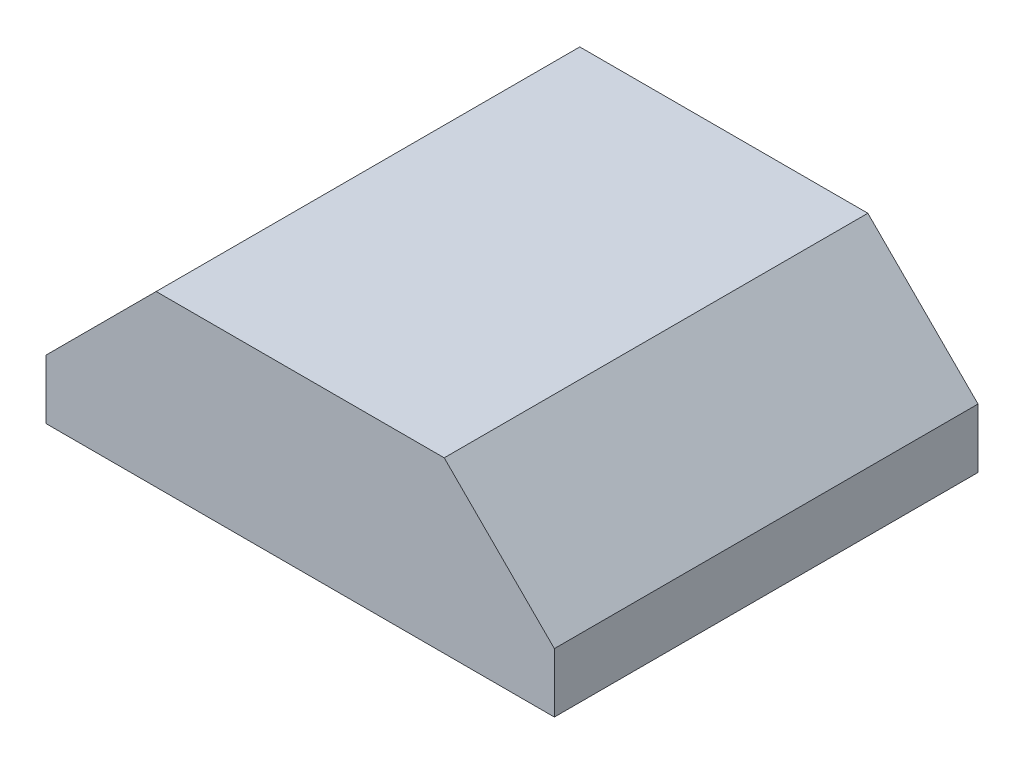
ISO-10303-21;
HEADER;
FILE_DESCRIPTION(('STEP AP214'),'2;1');
FILE_NAME('part.step','',(''),(''),'','','');
FILE_SCHEMA(('AUTOMOTIVE_DESIGN { 1 0 10303 214 1 1 1 1 }'));
ENDSEC;
DATA;
#1=APPLICATION_CONTEXT('core data for automotive mechanical design processes');
#2=APPLICATION_PROTOCOL_DEFINITION('international standard','automotive_design',2000,#1);
#3=PRODUCT_CONTEXT('',#1,'mechanical');
#4=PRODUCT('Part','Part','',(#3));
#5=PRODUCT_RELATED_PRODUCT_CATEGORY('part','',(#4));
#6=PRODUCT_DEFINITION_FORMATION('','',#4);
#7=PRODUCT_DEFINITION_CONTEXT('part definition',#1,'design');
#8=PRODUCT_DEFINITION('design','',#6,#7);
#9=PRODUCT_DEFINITION_SHAPE('','',#8);
#10=(LENGTH_UNIT() NAMED_UNIT(*) SI_UNIT(.MILLI.,.METRE.));
#11=(NAMED_UNIT(*) PLANE_ANGLE_UNIT() SI_UNIT($,.RADIAN.));
#12=(NAMED_UNIT(*) SI_UNIT($,.STERADIAN.) SOLID_ANGLE_UNIT());
#13=UNCERTAINTY_MEASURE_WITH_UNIT(LENGTH_MEASURE(1.E-05),#10,'distance_accuracy_value','');
#14=(GEOMETRIC_REPRESENTATION_CONTEXT(3) GLOBAL_UNCERTAINTY_ASSIGNED_CONTEXT((#13)) GLOBAL_UNIT_ASSIGNED_CONTEXT((#10,
#11,#12)) REPRESENTATION_CONTEXT('',''));
#15=CARTESIAN_POINT('',(0.,0.,0.));
#16=DIRECTION('',(0.,0.,1.));
#17=DIRECTION('',(1.,0.,0.));
#18=AXIS2_PLACEMENT_3D('',#15,#16,#17);
#19=CARTESIAN_POINT('',(3.4,1.80885878693797,10.));
#20=DIRECTION('',(0.707106781186549,0.707106781186546,0.));
#21=DIRECTION('',(-0.707106781186546,0.707106781186549,0.));
#22=AXIS2_PLACEMENT_3D('',#19,#20,#21);
#23=PLANE('',#22);
#24=DIRECTION('',(0.707106781186546,-0.707106781186549,0.));
#25=VECTOR('',#24,1.);
#26=CARTESIAN_POINT('',(3.4,1.80885878693797,0.));
#27=LINE('',#26,#25);
#28=CARTESIAN_POINT('',(3.4,1.80885878693797,0.));
#29=VERTEX_POINT('',#28);
#30=CARTESIAN_POINT('',(6.,-0.791141213062042,0.));
#31=VERTEX_POINT('',#30);
#32=EDGE_CURVE('E127',#29,#31,#27,.T.);
#33=ORIENTED_EDGE('',*,*,#32,.F.);
#34=DIRECTION('',(0.,0.,-1.));
#35=VECTOR('',#34,1.);
#36=CARTESIAN_POINT('',(3.4,1.80885878693797,10.));
#37=LINE('',#36,#35);
#38=CARTESIAN_POINT('',(3.4,1.80885878693797,10.));
#39=VERTEX_POINT('',#38);
#40=EDGE_CURVE('E11',#39,#29,#37,.T.);
#41=ORIENTED_EDGE('',*,*,#40,.F.);
#42=DIRECTION('',(0.707106781186546,-0.707106781186549,0.));
#43=VECTOR('',#42,1.);
#44=CARTESIAN_POINT('',(3.4,1.80885878693797,10.));
#45=LINE('',#44,#43);
#46=CARTESIAN_POINT('',(6.,-0.791141213062042,10.));
#47=VERTEX_POINT('',#46);
#48=EDGE_CURVE('E139',#39,#47,#45,.T.);
#49=ORIENTED_EDGE('',*,*,#48,.T.);
#50=DIRECTION('',(0.,0.,-1.));
#51=VECTOR('',#50,1.);
#52=CARTESIAN_POINT('',(6.,-0.791141213062042,10.));
#53=LINE('',#52,#51);
#54=EDGE_CURVE('E44',#47,#31,#53,.T.);
#55=ORIENTED_EDGE('',*,*,#54,.T.);
#56=EDGE_LOOP('',(#33,#41,#49,#55));
#57=FACE_BOUND('',#56,.T.);
#58=ADVANCED_FACE('F41',(#57),#23,.T.);
#59=CARTESIAN_POINT('',(3.4,1.80885878693797,10.));
#60=DIRECTION('',(0.,-1.,0.));
#61=DIRECTION('',(0.,0.,-1.));
#62=AXIS2_PLACEMENT_3D('',#59,#60,#61);
#63=PLANE('',#62);
#64=DIRECTION('',(-1.,0.,0.));
#65=VECTOR('',#64,1.);
#66=CARTESIAN_POINT('',(3.4,1.80885878693797,0.));
#67=LINE('',#66,#65);
#68=CARTESIAN_POINT('',(-3.4,1.80885878693797,0.));
#69=VERTEX_POINT('',#68);
#70=EDGE_CURVE('E80',#29,#69,#67,.T.);
#71=ORIENTED_EDGE('',*,*,#70,.T.);
#72=DIRECTION('',(0.,0.,-1.));
#73=VECTOR('',#72,1.);
#74=CARTESIAN_POINT('',(-3.4,1.80885878693797,10.));
#75=LINE('',#74,#73);
#76=CARTESIAN_POINT('',(-3.4,1.80885878693797,10.));
#77=VERTEX_POINT('',#76);
#78=EDGE_CURVE('E50',#77,#69,#75,.T.);
#79=ORIENTED_EDGE('',*,*,#78,.F.);
#80=DIRECTION('',(-1.,0.,0.));
#81=VECTOR('',#80,1.);
#82=CARTESIAN_POINT('',(3.4,1.80885878693797,10.));
#83=LINE('',#82,#81);
#84=EDGE_CURVE('E105',#39,#77,#83,.T.);
#85=ORIENTED_EDGE('',*,*,#84,.F.);
#86=ORIENTED_EDGE('',*,*,#40,.T.);
#87=EDGE_LOOP('',(#71,#79,#85,#86));
#88=FACE_BOUND('',#87,.T.);
#89=ADVANCED_FACE('F159',(#88),#63,.F.);
#90=CARTESIAN_POINT('',(-3.4,1.80885878693797,10.));
#91=DIRECTION('',(0.707106781186549,-0.707106781186546,0.));
#92=DIRECTION('',(0.707106781186546,0.707106781186549,0.));
#93=AXIS2_PLACEMENT_3D('',#90,#91,#92);
#94=PLANE('',#93);
#95=DIRECTION('',(-0.707106781186546,-0.707106781186549,0.));
#96=VECTOR('',#95,1.);
#97=CARTESIAN_POINT('',(-3.4,1.80885878693797,0.));
#98=LINE('',#97,#96);
#99=CARTESIAN_POINT('',(-6.,-0.791141213062042,0.));
#100=VERTEX_POINT('',#99);
#101=EDGE_CURVE('E112',#69,#100,#98,.T.);
#102=ORIENTED_EDGE('',*,*,#101,.T.);
#103=DIRECTION('',(0.,0.,-1.));
#104=VECTOR('',#103,1.);
#105=CARTESIAN_POINT('',(-6.,-0.791141213062042,10.));
#106=LINE('',#105,#104);
#107=CARTESIAN_POINT('',(-6.,-0.791141213062042,10.));
#108=VERTEX_POINT('',#107);
#109=EDGE_CURVE('E109',#108,#100,#106,.T.);
#110=ORIENTED_EDGE('',*,*,#109,.F.);
#111=DIRECTION('',(-0.707106781186546,-0.707106781186549,0.));
#112=VECTOR('',#111,1.);
#113=CARTESIAN_POINT('',(-3.4,1.80885878693797,10.));
#114=LINE('',#113,#112);
#115=EDGE_CURVE('E98',#77,#108,#114,.T.);
#116=ORIENTED_EDGE('',*,*,#115,.F.);
#117=ORIENTED_EDGE('',*,*,#78,.T.);
#118=EDGE_LOOP('',(#102,#110,#116,#117));
#119=FACE_BOUND('',#118,.T.);
#120=ADVANCED_FACE('F110',(#119),#94,.F.);
#121=CARTESIAN_POINT('',(-6.,-0.791141213062042,10.));
#122=DIRECTION('',(1.,0.,0.));
#123=DIRECTION('',(0.,0.,-1.));
#124=AXIS2_PLACEMENT_3D('',#121,#122,#123);
#125=PLANE('',#124);
#126=DIRECTION('',(0.,-1.,0.));
#127=VECTOR('',#126,1.);
#128=CARTESIAN_POINT('',(-6.,-0.791141213062042,0.));
#129=LINE('',#128,#127);
#130=CARTESIAN_POINT('',(-6.,-2.19114121306203,0.));
#131=VERTEX_POINT('',#130);
#132=EDGE_CURVE('E136',#100,#131,#129,.T.);
#133=ORIENTED_EDGE('',*,*,#132,.T.);
#134=DIRECTION('',(0.,0.,-1.));
#135=VECTOR('',#134,1.);
#136=CARTESIAN_POINT('',(-6.,-2.19114121306203,10.));
#137=LINE('',#136,#135);
#138=CARTESIAN_POINT('',(-6.,-2.19114121306203,10.));
#139=VERTEX_POINT('',#138);
#140=EDGE_CURVE('E115',#139,#131,#137,.T.);
#141=ORIENTED_EDGE('',*,*,#140,.F.);
#142=DIRECTION('',(0.,-1.,0.));
#143=VECTOR('',#142,1.);
#144=CARTESIAN_POINT('',(-6.,-0.791141213062042,10.));
#145=LINE('',#144,#143);
#146=EDGE_CURVE('E103',#108,#139,#145,.T.);
#147=ORIENTED_EDGE('',*,*,#146,.F.);
#148=ORIENTED_EDGE('',*,*,#109,.T.);
#149=EDGE_LOOP('',(#133,#141,#147,#148));
#150=FACE_BOUND('',#149,.T.);
#151=ADVANCED_FACE('F117',(#150),#125,.F.);
#152=CARTESIAN_POINT('',(-6.,-2.19114121306203,10.));
#153=DIRECTION('',(0.,1.,0.));
#154=DIRECTION('',(0.,0.,1.));
#155=AXIS2_PLACEMENT_3D('',#152,#153,#154);
#156=PLANE('',#155);
#157=DIRECTION('',(1.,0.,0.));
#158=VECTOR('',#157,1.);
#159=CARTESIAN_POINT('',(-6.,-2.19114121306203,0.));
#160=LINE('',#159,#158);
#161=CARTESIAN_POINT('',(6.,-2.19114121306203,0.));
#162=VERTEX_POINT('',#161);
#163=EDGE_CURVE('E133',#131,#162,#160,.T.);
#164=ORIENTED_EDGE('',*,*,#163,.T.);
#165=DIRECTION('',(0.,0.,-1.));
#166=VECTOR('',#165,1.);
#167=CARTESIAN_POINT('',(6.,-2.19114121306203,10.));
#168=LINE('',#167,#166);
#169=CARTESIAN_POINT('',(6.,-2.19114121306203,10.));
#170=VERTEX_POINT('',#169);
#171=EDGE_CURVE('E142',#170,#162,#168,.T.);
#172=ORIENTED_EDGE('',*,*,#171,.F.);
#173=DIRECTION('',(1.,0.,0.));
#174=VECTOR('',#173,1.);
#175=CARTESIAN_POINT('',(-6.,-2.19114121306203,10.));
#176=LINE('',#175,#174);
#177=EDGE_CURVE('E120',#139,#170,#176,.T.);
#178=ORIENTED_EDGE('',*,*,#177,.F.);
#179=ORIENTED_EDGE('',*,*,#140,.T.);
#180=EDGE_LOOP('',(#164,#172,#178,#179));
#181=FACE_BOUND('',#180,.T.);
#182=ADVANCED_FACE('F149',(#181),#156,.F.);
#183=CARTESIAN_POINT('',(6.,-0.791141213062042,10.));
#184=DIRECTION('',(1.,0.,0.));
#185=DIRECTION('',(0.,0.,-1.));
#186=AXIS2_PLACEMENT_3D('',#183,#184,#185);
#187=PLANE('',#186);
#188=DIRECTION('',(0.,-1.,0.));
#189=VECTOR('',#188,1.);
#190=CARTESIAN_POINT('',(6.,-0.791141213062042,0.));
#191=LINE('',#190,#189);
#192=EDGE_CURVE('E130',#31,#162,#191,.T.);
#193=ORIENTED_EDGE('',*,*,#192,.F.);
#194=ORIENTED_EDGE('',*,*,#54,.F.);
#195=DIRECTION('',(0.,-1.,0.));
#196=VECTOR('',#195,1.);
#197=CARTESIAN_POINT('',(6.,-0.791141213062042,10.));
#198=LINE('',#197,#196);
#199=EDGE_CURVE('E122',#47,#170,#198,.T.);
#200=ORIENTED_EDGE('',*,*,#199,.T.);
#201=ORIENTED_EDGE('',*,*,#171,.T.);
#202=EDGE_LOOP('',(#193,#194,#200,#201));
#203=FACE_BOUND('',#202,.T.);
#204=ADVANCED_FACE('F144',(#203),#187,.T.);
#205=CARTESIAN_POINT('',(0.,0.,10.));
#206=DIRECTION('',(0.,0.,-1.));
#207=DIRECTION('',(-1.,0.,0.));
#208=AXIS2_PLACEMENT_3D('',#205,#206,#207);
#209=PLANE('',#208);
#210=ORIENTED_EDGE('',*,*,#48,.F.);
#211=ORIENTED_EDGE('',*,*,#84,.T.);
#212=ORIENTED_EDGE('',*,*,#115,.T.);
#213=ORIENTED_EDGE('',*,*,#146,.T.);
#214=ORIENTED_EDGE('',*,*,#177,.T.);
#215=ORIENTED_EDGE('',*,*,#199,.F.);
#216=EDGE_LOOP('',(#210,#211,#212,#213,#214,#215));
#217=FACE_BOUND('',#216,.T.);
#218=ADVANCED_FACE('F101',(#217),#209,.F.);
#219=CARTESIAN_POINT('',(0.,0.,0.));
#220=DIRECTION('',(0.,0.,-1.));
#221=DIRECTION('',(-1.,0.,0.));
#222=AXIS2_PLACEMENT_3D('',#219,#220,#221);
#223=PLANE('',#222);
#224=ORIENTED_EDGE('',*,*,#32,.T.);
#225=ORIENTED_EDGE('',*,*,#192,.T.);
#226=ORIENTED_EDGE('',*,*,#163,.F.);
#227=ORIENTED_EDGE('',*,*,#132,.F.);
#228=ORIENTED_EDGE('',*,*,#101,.F.);
#229=ORIENTED_EDGE('',*,*,#70,.F.);
#230=EDGE_LOOP('',(#224,#225,#226,#227,#228,#229));
#231=FACE_BOUND('',#230,.T.);
#232=ADVANCED_FACE('F147',(#231),#223,.T.);
#233=CLOSED_SHELL('',(#58,#89,#120,#151,#182,#204,#218,#232));
#234=MANIFOLD_SOLID_BREP('B2',#233);
#235=ADVANCED_BREP_SHAPE_REPRESENTATION('',(#18,#234),#14);
#236=SHAPE_DEFINITION_REPRESENTATION(#9,#235);
ENDSEC;
END-ISO-10303-21;
